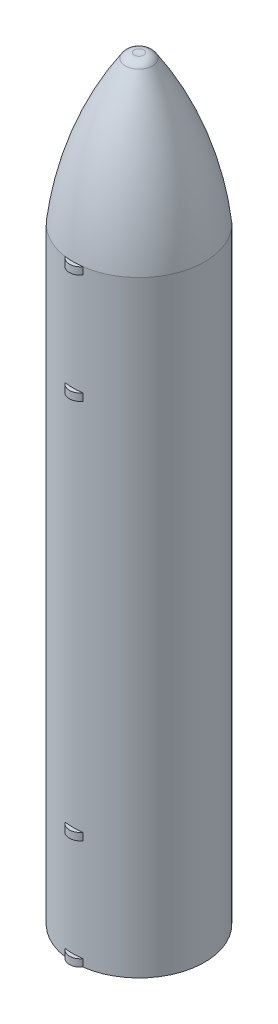
ISO-10303-21;
HEADER;
FILE_DESCRIPTION(('STEP AP214'),'2;1');
FILE_NAME('part.step','',(''),(''),'','','');
FILE_SCHEMA(('AUTOMOTIVE_DESIGN { 1 0 10303 214 1 1 1 1 }'));
ENDSEC;
DATA;
#1=APPLICATION_CONTEXT('core data for automotive mechanical design processes');
#2=APPLICATION_PROTOCOL_DEFINITION('international standard','automotive_design',2000,#1);
#3=PRODUCT_CONTEXT('',#1,'mechanical');
#4=PRODUCT('Part','Part','',(#3));
#5=PRODUCT_RELATED_PRODUCT_CATEGORY('part','',(#4));
#6=PRODUCT_DEFINITION_FORMATION('','',#4);
#7=PRODUCT_DEFINITION_CONTEXT('part definition',#1,'design');
#8=PRODUCT_DEFINITION('design','',#6,#7);
#9=PRODUCT_DEFINITION_SHAPE('','',#8);
#10=(LENGTH_UNIT() NAMED_UNIT(*) SI_UNIT(.MILLI.,.METRE.));
#11=(NAMED_UNIT(*) PLANE_ANGLE_UNIT() SI_UNIT($,.RADIAN.));
#12=(NAMED_UNIT(*) SI_UNIT($,.STERADIAN.) SOLID_ANGLE_UNIT());
#13=UNCERTAINTY_MEASURE_WITH_UNIT(LENGTH_MEASURE(1.E-05),#10,'distance_accuracy_value','');
#14=(GEOMETRIC_REPRESENTATION_CONTEXT(3) GLOBAL_UNCERTAINTY_ASSIGNED_CONTEXT((#13)) GLOBAL_UNIT_ASSIGNED_CONTEXT((#10,
#11,#12)) REPRESENTATION_CONTEXT('',''));
#15=CARTESIAN_POINT('',(0.,0.,0.));
#16=DIRECTION('',(0.,0.,1.));
#17=DIRECTION('',(1.,0.,0.));
#18=AXIS2_PLACEMENT_3D('',#15,#16,#17);
#19=CARTESIAN_POINT('',(0.,41600.,0.));
#20=DIRECTION('',(0.,-1.,0.));
#21=DIRECTION('',(0.,0.,-1.));
#22=AXIS2_PLACEMENT_3D('',#19,#20,#21);
#23=CYLINDRICAL_SURFACE('',#22,4500.);
#24=DIRECTION('',(0.,1.,0.));
#25=VECTOR('',#24,1.);
#26=CARTESIAN_POINT('',(607.254747716938,33600.,4458.83860118027));
#27=LINE('',#26,#25);
#28=CARTESIAN_POINT('',(607.254747716935,33600.,4458.83860118027));
#29=VERTEX_POINT('',#28);
#30=CARTESIAN_POINT('',(607.254747716936,34100.,4458.83860118027));
#31=VERTEX_POINT('',#30);
#32=EDGE_CURVE('E66',#29,#31,#27,.T.);
#33=ORIENTED_EDGE('',*,*,#32,.F.);
#34=CARTESIAN_POINT('',(0.,33600.,0.));
#35=DIRECTION('',(0.,-1.,0.));
#36=DIRECTION('',(0.,0.,-1.));
#37=AXIS2_PLACEMENT_3D('',#34,#35,#36);
#38=CIRCLE('',#37,4500.);
#39=CARTESIAN_POINT('',(-607.254747716937,33600.,4458.83860118027));
#40=VERTEX_POINT('',#39);
#41=EDGE_CURVE('E61',#29,#40,#38,.T.);
#42=ORIENTED_EDGE('',*,*,#41,.T.);
#43=DIRECTION('',(0.,1.,0.));
#44=VECTOR('',#43,1.);
#45=CARTESIAN_POINT('',(-607.254747716937,33600.,4458.83860118027));
#46=LINE('',#45,#44);
#47=CARTESIAN_POINT('',(-607.254747716937,34100.,4458.83860118027));
#48=VERTEX_POINT('',#47);
#49=EDGE_CURVE('E155',#40,#48,#46,.T.);
#50=ORIENTED_EDGE('',*,*,#49,.T.);
#51=CARTESIAN_POINT('',(0.,34100.,0.));
#52=DIRECTION('',(0.,-1.,0.));
#53=DIRECTION('',(0.,0.,-1.));
#54=AXIS2_PLACEMENT_3D('',#51,#52,#53);
#55=CIRCLE('',#54,4500.);
#56=EDGE_CURVE('E159',#31,#48,#55,.T.);
#57=ORIENTED_EDGE('',*,*,#56,.F.);
#58=EDGE_LOOP('',(#33,#42,#50,#57));
#59=FACE_BOUND('',#58,.T.);
#60=CARTESIAN_POINT('',(0.,41100.,0.));
#61=DIRECTION('',(0.,-1.,0.));
#62=DIRECTION('',(0.,0.,-1.));
#63=AXIS2_PLACEMENT_3D('',#60,#61,#62);
#64=CIRCLE('',#63,4500.);
#65=CARTESIAN_POINT('',(607.254747716938,41100.,4458.83860118027));
#66=VERTEX_POINT('',#65);
#67=CARTESIAN_POINT('',(-607.254747716937,41100.,4458.83860118027));
#68=VERTEX_POINT('',#67);
#69=EDGE_CURVE('E206',#66,#68,#64,.T.);
#70=ORIENTED_EDGE('',*,*,#69,.T.);
#71=DIRECTION('',(0.,1.,0.));
#72=VECTOR('',#71,1.);
#73=CARTESIAN_POINT('',(-607.254747716937,41100.,4458.83860118027));
#74=LINE('',#73,#72);
#75=CARTESIAN_POINT('',(-607.254747716937,41600.,4458.83860118027));
#76=VERTEX_POINT('',#75);
#77=EDGE_CURVE('E222',#68,#76,#74,.T.);
#78=ORIENTED_EDGE('',*,*,#77,.T.);
#79=CARTESIAN_POINT('',(0.,41600.,0.));
#80=DIRECTION('',(0.,1.,0.));
#81=DIRECTION('',(0.,0.,1.));
#82=AXIS2_PLACEMENT_3D('',#79,#80,#81);
#83=CIRCLE('',#82,4500.);
#84=CARTESIAN_POINT('',(-607.254747716937,41600.,-4458.83860118027));
#85=VERTEX_POINT('',#84);
#86=EDGE_CURVE('E54',#85,#76,#83,.T.);
#87=ORIENTED_EDGE('',*,*,#86,.F.);
#88=DIRECTION('',(0.,1.,0.));
#89=VECTOR('',#88,1.);
#90=CARTESIAN_POINT('',(-607.254747716938,41100.,-4458.83860118027));
#91=LINE('',#90,#89);
#92=CARTESIAN_POINT('',(-607.254747716938,41100.,-4458.83860118027));
#93=VERTEX_POINT('',#92);
#94=EDGE_CURVE('E235',#93,#85,#91,.T.);
#95=ORIENTED_EDGE('',*,*,#94,.F.);
#96=CARTESIAN_POINT('',(0.,41100.,0.));
#97=DIRECTION('',(0.,-1.,0.));
#98=DIRECTION('',(0.,0.,-1.));
#99=AXIS2_PLACEMENT_3D('',#96,#97,#98);
#100=CIRCLE('',#99,4500.);
#101=CARTESIAN_POINT('',(607.254747716937,41100.,-4458.83860118027));
#102=VERTEX_POINT('',#101);
#103=EDGE_CURVE('E230',#93,#102,#100,.T.);
#104=ORIENTED_EDGE('',*,*,#103,.T.);
#105=DIRECTION('',(0.,1.,0.));
#106=VECTOR('',#105,1.);
#107=CARTESIAN_POINT('',(607.254747716937,41100.,-4458.83860118027));
#108=LINE('',#107,#106);
#109=CARTESIAN_POINT('',(607.254747716937,41600.,-4458.83860118027));
#110=VERTEX_POINT('',#109);
#111=EDGE_CURVE('E215',#102,#110,#108,.T.);
#112=ORIENTED_EDGE('',*,*,#111,.T.);
#113=CARTESIAN_POINT('',(607.254747716936,41600.,4458.83860118027));
#114=VERTEX_POINT('',#113);
#115=EDGE_CURVE('E11',#114,#110,#83,.T.);
#116=ORIENTED_EDGE('',*,*,#115,.F.);
#117=DIRECTION('',(0.,1.,0.));
#118=VECTOR('',#117,1.);
#119=CARTESIAN_POINT('',(607.254747716938,41100.,4458.83860118027));
#120=LINE('',#119,#118);
#121=EDGE_CURVE('E211',#66,#114,#120,.T.);
#122=ORIENTED_EDGE('',*,*,#121,.F.);
#123=EDGE_LOOP('',(#70,#78,#87,#95,#104,#112,#116,#122));
#124=FACE_BOUND('',#123,.T.);
#125=DIRECTION('',(0.,-1.,0.));
#126=VECTOR('',#125,1.);
#127=CARTESIAN_POINT('',(-607.254747716937,8000.,4458.83860118027));
#128=LINE('',#127,#126);
#129=CARTESIAN_POINT('',(-607.254747716937,8000.,4458.83860118027));
#130=VERTEX_POINT('',#129);
#131=CARTESIAN_POINT('',(-607.254747716938,7500.,4458.83860118027));
#132=VERTEX_POINT('',#131);
#133=EDGE_CURVE('E256',#130,#132,#128,.T.);
#134=ORIENTED_EDGE('',*,*,#133,.F.);
#135=CARTESIAN_POINT('',(0.,8000.,0.));
#136=DIRECTION('',(0.,-1.,0.));
#137=DIRECTION('',(0.,0.,-1.));
#138=AXIS2_PLACEMENT_3D('',#135,#136,#137);
#139=CIRCLE('',#138,4500.);
#140=CARTESIAN_POINT('',(607.254747716935,8000.,4458.83860118027));
#141=VERTEX_POINT('',#140);
#142=EDGE_CURVE('E251',#141,#130,#139,.T.);
#143=ORIENTED_EDGE('',*,*,#142,.F.);
#144=DIRECTION('',(0.,-1.,0.));
#145=VECTOR('',#144,1.);
#146=CARTESIAN_POINT('',(607.254747716938,8000.,4458.83860118027));
#147=LINE('',#146,#145);
#148=CARTESIAN_POINT('',(607.254747716938,7500.,4458.83860118027));
#149=VERTEX_POINT('',#148);
#150=EDGE_CURVE('E267',#141,#149,#147,.T.);
#151=ORIENTED_EDGE('',*,*,#150,.T.);
#152=CARTESIAN_POINT('',(0.,7500.,0.));
#153=DIRECTION('',(0.,-1.,0.));
#154=DIRECTION('',(0.,0.,-1.));
#155=AXIS2_PLACEMENT_3D('',#152,#153,#154);
#156=CIRCLE('',#155,4500.);
#157=EDGE_CURVE('E252',#149,#132,#156,.T.);
#158=ORIENTED_EDGE('',*,*,#157,.T.);
#159=EDGE_LOOP('',(#134,#143,#151,#158));
#160=FACE_BOUND('',#159,.T.);
#161=DIRECTION('',(0.,-1.,0.));
#162=VECTOR('',#161,1.);
#163=CARTESIAN_POINT('',(-607.254747716937,500.,4458.83860118027));
#164=LINE('',#163,#162);
#165=CARTESIAN_POINT('',(-607.254747716938,500.,4458.83860118027));
#166=VERTEX_POINT('',#165);
#167=CARTESIAN_POINT('',(-607.254747716937,0.,4458.83860118027));
#168=VERTEX_POINT('',#167);
#169=EDGE_CURVE('E300',#166,#168,#164,.T.);
#170=ORIENTED_EDGE('',*,*,#169,.F.);
#171=CARTESIAN_POINT('',(0.,500.,0.));
#172=DIRECTION('',(0.,-1.,0.));
#173=DIRECTION('',(0.,0.,-1.));
#174=AXIS2_PLACEMENT_3D('',#171,#172,#173);
#175=CIRCLE('',#174,4500.);
#176=CARTESIAN_POINT('',(607.254747716936,500.,4458.83860118027));
#177=VERTEX_POINT('',#176);
#178=EDGE_CURVE('E295',#177,#166,#175,.T.);
#179=ORIENTED_EDGE('',*,*,#178,.F.);
#180=DIRECTION('',(0.,-1.,0.));
#181=VECTOR('',#180,1.);
#182=CARTESIAN_POINT('',(607.254747716938,500.,4458.83860118027));
#183=LINE('',#182,#181);
#184=CARTESIAN_POINT('',(607.254747716938,0.,4458.83860118027));
#185=VERTEX_POINT('',#184);
#186=EDGE_CURVE('E308',#177,#185,#183,.T.);
#187=ORIENTED_EDGE('',*,*,#186,.T.);
#188=CARTESIAN_POINT('',(0.,0.,0.));
#189=DIRECTION('',(0.,1.,0.));
#190=DIRECTION('',(0.,0.,1.));
#191=AXIS2_PLACEMENT_3D('',#188,#189,#190);
#192=CIRCLE('',#191,4500.);
#193=CARTESIAN_POINT('',(607.254747716937,0.,-4458.83860118027));
#194=VERTEX_POINT('',#193);
#195=EDGE_CURVE('E48',#185,#194,#192,.T.);
#196=ORIENTED_EDGE('',*,*,#195,.T.);
#197=DIRECTION('',(0.,-1.,0.));
#198=VECTOR('',#197,1.);
#199=CARTESIAN_POINT('',(607.254747716937,500.,-4458.83860118027));
#200=LINE('',#199,#198);
#201=CARTESIAN_POINT('',(607.254747716937,500.,-4458.83860118027));
#202=VERTEX_POINT('',#201);
#203=EDGE_CURVE('E313',#202,#194,#200,.T.);
#204=ORIENTED_EDGE('',*,*,#203,.F.);
#205=CARTESIAN_POINT('',(0.,500.,0.));
#206=DIRECTION('',(0.,-1.,0.));
#207=DIRECTION('',(0.,0.,-1.));
#208=AXIS2_PLACEMENT_3D('',#205,#206,#207);
#209=CIRCLE('',#208,4500.);
#210=CARTESIAN_POINT('',(-607.254747716937,500.,-4458.83860118027));
#211=VERTEX_POINT('',#210);
#212=EDGE_CURVE('E317',#211,#202,#209,.T.);
#213=ORIENTED_EDGE('',*,*,#212,.F.);
#214=DIRECTION('',(0.,-1.,0.));
#215=VECTOR('',#214,1.);
#216=CARTESIAN_POINT('',(-607.254747716938,500.,-4458.83860118027));
#217=LINE('',#216,#215);
#218=CARTESIAN_POINT('',(-607.254747716938,0.,-4458.83860118027));
#219=VERTEX_POINT('',#218);
#220=EDGE_CURVE('E270',#211,#219,#217,.T.);
#221=ORIENTED_EDGE('',*,*,#220,.T.);
#222=EDGE_CURVE('E337',#219,#168,#192,.T.);
#223=ORIENTED_EDGE('',*,*,#222,.T.);
#224=EDGE_LOOP('',(#170,#179,#187,#196,#204,#213,#221,#223));
#225=FACE_BOUND('',#224,.T.);
#226=CARTESIAN_POINT('',(0.,8000.,0.));
#227=DIRECTION('',(0.,-1.,0.));
#228=DIRECTION('',(0.,0.,-1.));
#229=AXIS2_PLACEMENT_3D('',#226,#227,#228);
#230=CIRCLE('',#229,4500.);
#231=CARTESIAN_POINT('',(-607.254747716938,8000.,-4458.83860118027));
#232=VERTEX_POINT('',#231);
#233=CARTESIAN_POINT('',(607.254747716937,8000.,-4458.83860118027));
#234=VERTEX_POINT('',#233);
#235=EDGE_CURVE('E275',#232,#234,#230,.T.);
#236=ORIENTED_EDGE('',*,*,#235,.F.);
#237=DIRECTION('',(0.,-1.,0.));
#238=VECTOR('',#237,1.);
#239=CARTESIAN_POINT('',(-607.254747716938,8000.,-4458.83860118027));
#240=LINE('',#239,#238);
#241=CARTESIAN_POINT('',(-607.254747716938,7500.,-4458.83860118027));
#242=VERTEX_POINT('',#241);
#243=EDGE_CURVE('E261',#232,#242,#240,.T.);
#244=ORIENTED_EDGE('',*,*,#243,.T.);
#245=CARTESIAN_POINT('',(0.,7500.,0.));
#246=DIRECTION('',(0.,-1.,0.));
#247=DIRECTION('',(0.,0.,-1.));
#248=AXIS2_PLACEMENT_3D('',#245,#246,#247);
#249=CIRCLE('',#248,4500.);
#250=CARTESIAN_POINT('',(607.254747716937,7500.,-4458.83860118027));
#251=VERTEX_POINT('',#250);
#252=EDGE_CURVE('E276',#242,#251,#249,.T.);
#253=ORIENTED_EDGE('',*,*,#252,.T.);
#254=DIRECTION('',(0.,-1.,0.));
#255=VECTOR('',#254,1.);
#256=CARTESIAN_POINT('',(607.254747716937,8000.,-4458.83860118027));
#257=LINE('',#256,#255);
#258=EDGE_CURVE('E279',#234,#251,#257,.T.);
#259=ORIENTED_EDGE('',*,*,#258,.F.);
#260=EDGE_LOOP('',(#236,#244,#253,#259));
#261=FACE_BOUND('',#260,.T.);
#262=CARTESIAN_POINT('',(0.,33600.,0.));
#263=DIRECTION('',(0.,-1.,0.));
#264=DIRECTION('',(0.,0.,-1.));
#265=AXIS2_PLACEMENT_3D('',#262,#263,#264);
#266=CIRCLE('',#265,4500.);
#267=CARTESIAN_POINT('',(-607.254747716938,33600.,-4458.83860118027));
#268=VERTEX_POINT('',#267);
#269=CARTESIAN_POINT('',(607.254747716937,33600.,-4458.83860118027));
#270=VERTEX_POINT('',#269);
#271=EDGE_CURVE('E185',#268,#270,#266,.T.);
#272=ORIENTED_EDGE('',*,*,#271,.T.);
#273=DIRECTION('',(0.,1.,0.));
#274=VECTOR('',#273,1.);
#275=CARTESIAN_POINT('',(607.254747716937,33600.,-4458.83860118027));
#276=LINE('',#275,#274);
#277=CARTESIAN_POINT('',(607.254747716937,34100.,-4458.83860118027));
#278=VERTEX_POINT('',#277);
#279=EDGE_CURVE('E170',#270,#278,#276,.T.);
#280=ORIENTED_EDGE('',*,*,#279,.T.);
#281=CARTESIAN_POINT('',(0.,34100.,0.));
#282=DIRECTION('',(0.,-1.,0.));
#283=DIRECTION('',(0.,0.,-1.));
#284=AXIS2_PLACEMENT_3D('',#281,#282,#283);
#285=CIRCLE('',#284,4500.);
#286=CARTESIAN_POINT('',(-607.254747716937,34100.,-4458.83860118027));
#287=VERTEX_POINT('',#286);
#288=EDGE_CURVE('E186',#287,#278,#285,.T.);
#289=ORIENTED_EDGE('',*,*,#288,.F.);
#290=DIRECTION('',(0.,1.,0.));
#291=VECTOR('',#290,1.);
#292=CARTESIAN_POINT('',(-607.254747716938,33600.,-4458.83860118027));
#293=LINE('',#292,#291);
#294=EDGE_CURVE('E190',#268,#287,#293,.T.);
#295=ORIENTED_EDGE('',*,*,#294,.F.);
#296=EDGE_LOOP('',(#272,#280,#289,#295));
#297=FACE_BOUND('',#296,.T.);
#298=ADVANCED_FACE('F45',(#59,#124,#160,#225,#261,#297),#23,.T.);
#299=CARTESIAN_POINT('',(0.,0.,0.));
#300=DIRECTION('',(0.,1.,0.));
#301=DIRECTION('',(0.,0.,1.));
#302=AXIS2_PLACEMENT_3D('',#299,#300,#301);
#303=PLANE('',#302);
#304=ORIENTED_EDGE('',*,*,#195,.F.);
#305=CARTESIAN_POINT('',(-9.84292141829682E-13,0.,4018.67764042246));
#306=DIRECTION('',(0.,1.,0.));
#307=DIRECTION('',(0.,0.,1.));
#308=AXIS2_PLACEMENT_3D('',#305,#306,#307);
#309=CIRCLE('',#308,749.999999999998);
#310=EDGE_CURVE('E296',#168,#185,#309,.T.);
#311=ORIENTED_EDGE('',*,*,#310,.F.);
#312=ORIENTED_EDGE('',*,*,#222,.F.);
#313=CARTESIAN_POINT('',(0.,0.,-4018.67764042246));
#314=DIRECTION('',(0.,-1.,0.));
#315=DIRECTION('',(0.,0.,-1.));
#316=AXIS2_PLACEMENT_3D('',#313,#314,#315);
#317=CIRCLE('',#316,749.999999999998);
#318=EDGE_CURVE('E304',#219,#194,#317,.T.);
#319=ORIENTED_EDGE('',*,*,#318,.T.);
#320=EDGE_LOOP('',(#304,#311,#312,#319));
#321=FACE_BOUND('',#320,.T.);
#322=ADVANCED_FACE('F378',(#321),#303,.F.);
#323=CARTESIAN_POINT('',(0.,39138.2485032371,0.));
#324=DIRECTION('',(0.,1.,0.));
#325=DIRECTION('',(-1.,0.,0.));
#326=AXIS2_PLACEMENT_3D('',#323,#324,#325);
#327=DEGENERATE_TOROIDAL_SURFACE('',#326,17690.3080725105,22326.441561179,.F.);
#328=CARTESIAN_POINT('',(0.,51456.5596988805,0.));
#329=DIRECTION('',(0.,1.,0.));
#330=DIRECTION('',(-1.,0.,0.));
#331=AXIS2_PLACEMENT_3D('',#328,#329,#330);
#332=CIRCLE('',#331,930.357921809479);
#333=CARTESIAN_POINT('',(-930.357921809479,51456.5596988805,0.));
#334=VERTEX_POINT('',#333);
#335=EDGE_CURVE('E312',#334,#334,#332,.T.);
#336=ORIENTED_EDGE('',*,*,#335,.F.);
#337=EDGE_LOOP('',(#336));
#338=FACE_BOUND('',#337,.T.);
#339=ORIENTED_EDGE('',*,*,#115,.T.);
#340=CARTESIAN_POINT('',(0.,41600.,0.));
#341=DIRECTION('',(0.,-1.,0.));
#342=DIRECTION('',(0.,0.,-1.));
#343=AXIS2_PLACEMENT_3D('',#340,#341,#342);
#344=CIRCLE('',#343,4500.);
#345=EDGE_CURVE('E231',#85,#110,#344,.T.);
#346=ORIENTED_EDGE('',*,*,#345,.F.);
#347=ORIENTED_EDGE('',*,*,#86,.T.);
#348=CARTESIAN_POINT('',(0.,41600.,0.));
#349=DIRECTION('',(0.,-1.,0.));
#350=DIRECTION('',(0.,0.,-1.));
#351=AXIS2_PLACEMENT_3D('',#348,#349,#350);
#352=CIRCLE('',#351,4500.);
#353=EDGE_CURVE('E207',#114,#76,#352,.T.);
#354=ORIENTED_EDGE('',*,*,#353,.F.);
#355=EDGE_LOOP('',(#339,#346,#347,#354));
#356=FACE_BOUND('',#355,.T.);
#357=ADVANCED_FACE('F349',(#338,#356),#327,.F.);
#358=CARTESIAN_POINT('',(0.,51786.1860617529,0.));
#359=DIRECTION('',(0.,-1.,0.));
#360=DIRECTION('',(1.,0.,0.));
#361=AXIS2_PLACEMENT_3D('',#358,#359,#360);
#362=PLANE('',#361);
#363=CARTESIAN_POINT('',(0.,51786.1860617529,0.));
#364=DIRECTION('',(0.,1.,0.));
#365=DIRECTION('',(-1.,0.,0.));
#366=AXIS2_PLACEMENT_3D('',#363,#364,#365);
#367=CIRCLE('',#366,317.070306461789);
#368=CARTESIAN_POINT('',(-317.070306461789,51786.1860617529,0.));
#369=VERTEX_POINT('',#368);
#370=EDGE_CURVE('E334',#369,#369,#367,.T.);
#371=ORIENTED_EDGE('',*,*,#370,.T.);
#372=EDGE_LOOP('',(#371));
#373=FACE_BOUND('',#372,.T.);
#374=ADVANCED_FACE('F389',(#373),#362,.F.);
#375=CARTESIAN_POINT('',(0.,51050.8455477008,0.));
#376=DIRECTION('',(0.,1.,0.));
#377=DIRECTION('',(-1.,0.,0.));
#378=AXIS2_PLACEMENT_3D('',#375,#376,#377);
#379=DEGENERATE_TOROIDAL_SURFACE('',#378,317.070306461789,735.340514052042,.T.);
#380=ORIENTED_EDGE('',*,*,#370,.F.);
#381=EDGE_LOOP('',(#380));
#382=FACE_BOUND('',#381,.T.);
#383=ORIENTED_EDGE('',*,*,#335,.T.);
#384=EDGE_LOOP('',(#383));
#385=FACE_BOUND('',#384,.T.);
#386=ADVANCED_FACE('F395',(#382,#385),#379,.T.);
#387=CARTESIAN_POINT('',(0.,500.,-4018.67764042246));
#388=DIRECTION('',(0.,-1.,0.));
#389=DIRECTION('',(0.,0.,-1.));
#390=AXIS2_PLACEMENT_3D('',#387,#388,#389);
#391=CYLINDRICAL_SURFACE('',#390,749.999999999998);
#392=ORIENTED_EDGE('',*,*,#318,.F.);
#393=ORIENTED_EDGE('',*,*,#220,.F.);
#394=CARTESIAN_POINT('',(0.,500.,-4018.67764042246));
#395=DIRECTION('',(0.,-1.,0.));
#396=DIRECTION('',(0.,0.,-1.));
#397=AXIS2_PLACEMENT_3D('',#394,#395,#396);
#398=CIRCLE('',#397,749.999999999998);
#399=EDGE_CURVE('E324',#211,#202,#398,.T.);
#400=ORIENTED_EDGE('',*,*,#399,.T.);
#401=ORIENTED_EDGE('',*,*,#203,.T.);
#402=EDGE_LOOP('',(#392,#393,#400,#401));
#403=FACE_BOUND('',#402,.T.);
#404=ADVANCED_FACE('F397',(#403),#391,.T.);
#405=CARTESIAN_POINT('',(0.,500.,-2009.33882021123));
#406=DIRECTION('',(0.,-1.,0.));
#407=DIRECTION('',(0.,0.,-1.));
#408=AXIS2_PLACEMENT_3D('',#405,#406,#407);
#409=PLANE('',#408);
#410=ORIENTED_EDGE('',*,*,#399,.F.);
#411=ORIENTED_EDGE('',*,*,#212,.T.);
#412=EDGE_LOOP('',(#410,#411));
#413=FACE_BOUND('',#412,.T.);
#414=ADVANCED_FACE('F399',(#413),#409,.F.);
#415=CARTESIAN_POINT('',(-9.84292141829682E-13,500.,4018.67764042246));
#416=DIRECTION('',(0.,-1.,0.));
#417=DIRECTION('',(0.,0.,-1.));
#418=AXIS2_PLACEMENT_3D('',#415,#416,#417);
#419=CYLINDRICAL_SURFACE('',#418,749.999999999998);
#420=ORIENTED_EDGE('',*,*,#310,.T.);
#421=ORIENTED_EDGE('',*,*,#186,.F.);
#422=CARTESIAN_POINT('',(-9.84292141829682E-13,500.,4018.67764042246));
#423=DIRECTION('',(0.,1.,0.));
#424=DIRECTION('',(0.,0.,1.));
#425=AXIS2_PLACEMENT_3D('',#422,#423,#424);
#426=CIRCLE('',#425,749.999999999998);
#427=EDGE_CURVE('E291',#166,#177,#426,.T.);
#428=ORIENTED_EDGE('',*,*,#427,.F.);
#429=ORIENTED_EDGE('',*,*,#169,.T.);
#430=EDGE_LOOP('',(#420,#421,#428,#429));
#431=FACE_BOUND('',#430,.T.);
#432=ADVANCED_FACE('F402',(#431),#419,.T.);
#433=CARTESIAN_POINT('',(-4.92146070914841E-13,500.,2009.33882021123));
#434=DIRECTION('',(0.,1.,0.));
#435=DIRECTION('',(0.,0.,1.));
#436=AXIS2_PLACEMENT_3D('',#433,#434,#435);
#437=PLANE('',#436);
#438=ORIENTED_EDGE('',*,*,#427,.T.);
#439=ORIENTED_EDGE('',*,*,#178,.T.);
#440=EDGE_LOOP('',(#438,#439));
#441=FACE_BOUND('',#440,.T.);
#442=ADVANCED_FACE('F408',(#441),#437,.T.);
#443=CARTESIAN_POINT('',(0.,8000.,-4018.67764042246));
#444=DIRECTION('',(0.,-1.,0.));
#445=DIRECTION('',(0.,0.,-1.));
#446=AXIS2_PLACEMENT_3D('',#443,#444,#445);
#447=CYLINDRICAL_SURFACE('',#446,749.999999999998);
#448=CARTESIAN_POINT('',(0.,7500.,-4018.67764042246));
#449=DIRECTION('',(0.,-1.,0.));
#450=DIRECTION('',(0.,0.,-1.));
#451=AXIS2_PLACEMENT_3D('',#448,#449,#450);
#452=CIRCLE('',#451,749.999999999998);
#453=EDGE_CURVE('E226',#242,#251,#452,.T.);
#454=ORIENTED_EDGE('',*,*,#453,.F.);
#455=ORIENTED_EDGE('',*,*,#243,.F.);
#456=CARTESIAN_POINT('',(0.,8000.,-4018.67764042246));
#457=DIRECTION('',(0.,-1.,0.));
#458=DIRECTION('',(0.,0.,-1.));
#459=AXIS2_PLACEMENT_3D('',#456,#457,#458);
#460=CIRCLE('',#459,749.999999999998);
#461=EDGE_CURVE('E271',#232,#234,#460,.T.);
#462=ORIENTED_EDGE('',*,*,#461,.T.);
#463=ORIENTED_EDGE('',*,*,#258,.T.);
#464=EDGE_LOOP('',(#454,#455,#462,#463));
#465=FACE_BOUND('',#464,.T.);
#466=ADVANCED_FACE('F412',(#465),#447,.T.);
#467=CARTESIAN_POINT('',(0.,8000.,-2009.33882021123));
#468=DIRECTION('',(0.,-1.,0.));
#469=DIRECTION('',(0.,0.,-1.));
#470=AXIS2_PLACEMENT_3D('',#467,#468,#469);
#471=PLANE('',#470);
#472=ORIENTED_EDGE('',*,*,#461,.F.);
#473=ORIENTED_EDGE('',*,*,#235,.T.);
#474=EDGE_LOOP('',(#472,#473));
#475=FACE_BOUND('',#474,.T.);
#476=ADVANCED_FACE('F416',(#475),#471,.F.);
#477=CARTESIAN_POINT('',(0.,7500.,-2009.33882021123));
#478=DIRECTION('',(0.,-1.,0.));
#479=DIRECTION('',(0.,0.,-1.));
#480=AXIS2_PLACEMENT_3D('',#477,#478,#479);
#481=PLANE('',#480);
#482=ORIENTED_EDGE('',*,*,#453,.T.);
#483=ORIENTED_EDGE('',*,*,#252,.F.);
#484=EDGE_LOOP('',(#482,#483));
#485=FACE_BOUND('',#484,.T.);
#486=ADVANCED_FACE('F418',(#485),#481,.T.);
#487=CARTESIAN_POINT('',(-9.84292141829682E-13,8000.,4018.67764042246));
#488=DIRECTION('',(0.,-1.,0.));
#489=DIRECTION('',(0.,0.,-1.));
#490=AXIS2_PLACEMENT_3D('',#487,#488,#489);
#491=CYLINDRICAL_SURFACE('',#490,749.999999999998);
#492=CARTESIAN_POINT('',(-9.84292141829682E-13,7500.,4018.67764042246));
#493=DIRECTION('',(0.,1.,0.));
#494=DIRECTION('',(0.,0.,1.));
#495=AXIS2_PLACEMENT_3D('',#492,#493,#494);
#496=CIRCLE('',#495,749.999999999998);
#497=EDGE_CURVE('E257',#132,#149,#496,.T.);
#498=ORIENTED_EDGE('',*,*,#497,.T.);
#499=ORIENTED_EDGE('',*,*,#150,.F.);
#500=CARTESIAN_POINT('',(-9.84292141829682E-13,8000.,4018.67764042246));
#501=DIRECTION('',(0.,1.,0.));
#502=DIRECTION('',(0.,0.,1.));
#503=AXIS2_PLACEMENT_3D('',#500,#501,#502);
#504=CIRCLE('',#503,749.999999999998);
#505=EDGE_CURVE('E247',#130,#141,#504,.T.);
#506=ORIENTED_EDGE('',*,*,#505,.F.);
#507=ORIENTED_EDGE('',*,*,#133,.T.);
#508=EDGE_LOOP('',(#498,#499,#506,#507));
#509=FACE_BOUND('',#508,.T.);
#510=ADVANCED_FACE('F421',(#509),#491,.T.);
#511=CARTESIAN_POINT('',(-4.92146070914841E-13,8000.,2009.33882021123));
#512=DIRECTION('',(0.,1.,0.));
#513=DIRECTION('',(0.,0.,1.));
#514=AXIS2_PLACEMENT_3D('',#511,#512,#513);
#515=PLANE('',#514);
#516=ORIENTED_EDGE('',*,*,#505,.T.);
#517=ORIENTED_EDGE('',*,*,#142,.T.);
#518=EDGE_LOOP('',(#516,#517));
#519=FACE_BOUND('',#518,.T.);
#520=ADVANCED_FACE('F428',(#519),#515,.T.);
#521=CARTESIAN_POINT('',(-4.92146070914841E-13,7500.,2009.33882021123));
#522=DIRECTION('',(0.,1.,0.));
#523=DIRECTION('',(0.,0.,1.));
#524=AXIS2_PLACEMENT_3D('',#521,#522,#523);
#525=PLANE('',#524);
#526=ORIENTED_EDGE('',*,*,#497,.F.);
#527=ORIENTED_EDGE('',*,*,#157,.F.);
#528=EDGE_LOOP('',(#526,#527));
#529=FACE_BOUND('',#528,.T.);
#530=ADVANCED_FACE('F430',(#529),#525,.F.);
#531=CARTESIAN_POINT('',(0.,41100.,-4018.67764042246));
#532=DIRECTION('',(0.,1.,0.));
#533=DIRECTION('',(0.,0.,1.));
#534=AXIS2_PLACEMENT_3D('',#531,#532,#533);
#535=CYLINDRICAL_SURFACE('',#534,749.999999999998);
#536=CARTESIAN_POINT('',(0.,41600.,-4018.67764042246));
#537=DIRECTION('',(0.,-1.,0.));
#538=DIRECTION('',(0.,0.,-1.));
#539=AXIS2_PLACEMENT_3D('',#536,#537,#538);
#540=CIRCLE('',#539,749.999999999998);
#541=EDGE_CURVE('E163',#85,#110,#540,.T.);
#542=ORIENTED_EDGE('',*,*,#541,.T.);
#543=ORIENTED_EDGE('',*,*,#111,.F.);
#544=CARTESIAN_POINT('',(0.,41100.,-4018.67764042246));
#545=DIRECTION('',(0.,-1.,0.));
#546=DIRECTION('',(0.,0.,-1.));
#547=AXIS2_PLACEMENT_3D('',#544,#545,#546);
#548=CIRCLE('',#547,749.999999999998);
#549=EDGE_CURVE('E227',#93,#102,#548,.T.);
#550=ORIENTED_EDGE('',*,*,#549,.F.);
#551=ORIENTED_EDGE('',*,*,#94,.T.);
#552=EDGE_LOOP('',(#542,#543,#550,#551));
#553=FACE_BOUND('',#552,.T.);
#554=ADVANCED_FACE('F363',(#553),#535,.T.);
#555=CARTESIAN_POINT('',(0.,41100.,-2009.33882021123));
#556=DIRECTION('',(0.,1.,0.));
#557=DIRECTION('',(0.,0.,-1.));
#558=AXIS2_PLACEMENT_3D('',#555,#556,#557);
#559=PLANE('',#558);
#560=ORIENTED_EDGE('',*,*,#549,.T.);
#561=ORIENTED_EDGE('',*,*,#103,.F.);
#562=EDGE_LOOP('',(#560,#561));
#563=FACE_BOUND('',#562,.T.);
#564=ADVANCED_FACE('F367',(#563),#559,.F.);
#565=CARTESIAN_POINT('',(0.,41600.,-2009.33882021123));
#566=DIRECTION('',(0.,1.,0.));
#567=DIRECTION('',(0.,0.,-1.));
#568=AXIS2_PLACEMENT_3D('',#565,#566,#567);
#569=PLANE('',#568);
#570=ORIENTED_EDGE('',*,*,#541,.F.);
#571=ORIENTED_EDGE('',*,*,#345,.T.);
#572=EDGE_LOOP('',(#570,#571));
#573=FACE_BOUND('',#572,.T.);
#574=ADVANCED_FACE('F365',(#573),#569,.T.);
#575=CARTESIAN_POINT('',(-9.84292141829682E-13,41100.,4018.67764042246));
#576=DIRECTION('',(0.,1.,0.));
#577=DIRECTION('',(0.,0.,1.));
#578=AXIS2_PLACEMENT_3D('',#575,#576,#577);
#579=CYLINDRICAL_SURFACE('',#578,749.999999999998);
#580=CARTESIAN_POINT('',(-9.84292141829682E-13,41600.,4018.67764042246));
#581=DIRECTION('',(0.,1.,0.));
#582=DIRECTION('',(0.,0.,1.));
#583=AXIS2_PLACEMENT_3D('',#580,#581,#582);
#584=CIRCLE('',#583,749.999999999998);
#585=EDGE_CURVE('E212',#76,#114,#584,.T.);
#586=ORIENTED_EDGE('',*,*,#585,.F.);
#587=ORIENTED_EDGE('',*,*,#77,.F.);
#588=CARTESIAN_POINT('',(-9.84292141829682E-13,41100.,4018.67764042246));
#589=DIRECTION('',(0.,1.,0.));
#590=DIRECTION('',(0.,0.,1.));
#591=AXIS2_PLACEMENT_3D('',#588,#589,#590);
#592=CIRCLE('',#591,749.999999999998);
#593=EDGE_CURVE('E203',#68,#66,#592,.T.);
#594=ORIENTED_EDGE('',*,*,#593,.T.);
#595=ORIENTED_EDGE('',*,*,#121,.T.);
#596=EDGE_LOOP('',(#586,#587,#594,#595));
#597=FACE_BOUND('',#596,.T.);
#598=ADVANCED_FACE('F357',(#597),#579,.T.);
#599=CARTESIAN_POINT('',(-4.92146070914841E-13,41100.,2009.33882021123));
#600=DIRECTION('',(0.,-1.,0.));
#601=DIRECTION('',(0.,0.,1.));
#602=AXIS2_PLACEMENT_3D('',#599,#600,#601);
#603=PLANE('',#602);
#604=ORIENTED_EDGE('',*,*,#593,.F.);
#605=ORIENTED_EDGE('',*,*,#69,.F.);
#606=EDGE_LOOP('',(#604,#605));
#607=FACE_BOUND('',#606,.T.);
#608=ADVANCED_FACE('F359',(#607),#603,.T.);
#609=CARTESIAN_POINT('',(-4.92146070914841E-13,41600.,2009.33882021123));
#610=DIRECTION('',(0.,-1.,0.));
#611=DIRECTION('',(0.,0.,1.));
#612=AXIS2_PLACEMENT_3D('',#609,#610,#611);
#613=PLANE('',#612);
#614=ORIENTED_EDGE('',*,*,#585,.T.);
#615=ORIENTED_EDGE('',*,*,#353,.T.);
#616=EDGE_LOOP('',(#614,#615));
#617=FACE_BOUND('',#616,.T.);
#618=ADVANCED_FACE('F466',(#617),#613,.F.);
#619=CARTESIAN_POINT('',(0.,33600.,-4018.67764042246));
#620=DIRECTION('',(0.,1.,0.));
#621=DIRECTION('',(0.,0.,1.));
#622=AXIS2_PLACEMENT_3D('',#619,#620,#621);
#623=CYLINDRICAL_SURFACE('',#622,749.999999999998);
#624=CARTESIAN_POINT('',(0.,34100.,-4018.67764042246));
#625=DIRECTION('',(0.,-1.,0.));
#626=DIRECTION('',(0.,0.,-1.));
#627=AXIS2_PLACEMENT_3D('',#624,#625,#626);
#628=CIRCLE('',#627,749.999999999998);
#629=EDGE_CURVE('E191',#287,#278,#628,.T.);
#630=ORIENTED_EDGE('',*,*,#629,.T.);
#631=ORIENTED_EDGE('',*,*,#279,.F.);
#632=CARTESIAN_POINT('',(0.,33600.,-4018.67764042246));
#633=DIRECTION('',(0.,-1.,0.));
#634=DIRECTION('',(0.,0.,-1.));
#635=AXIS2_PLACEMENT_3D('',#632,#633,#634);
#636=CIRCLE('',#635,749.999999999998);
#637=EDGE_CURVE('E182',#268,#270,#636,.T.);
#638=ORIENTED_EDGE('',*,*,#637,.F.);
#639=ORIENTED_EDGE('',*,*,#294,.T.);
#640=EDGE_LOOP('',(#630,#631,#638,#639));
#641=FACE_BOUND('',#640,.T.);
#642=ADVANCED_FACE('F474',(#641),#623,.T.);
#643=CARTESIAN_POINT('',(0.,33600.,-2009.33882021123));
#644=DIRECTION('',(0.,1.,0.));
#645=DIRECTION('',(0.,0.,-1.));
#646=AXIS2_PLACEMENT_3D('',#643,#644,#645);
#647=PLANE('',#646);
#648=ORIENTED_EDGE('',*,*,#637,.T.);
#649=ORIENTED_EDGE('',*,*,#271,.F.);
#650=EDGE_LOOP('',(#648,#649));
#651=FACE_BOUND('',#650,.T.);
#652=ADVANCED_FACE('F489',(#651),#647,.F.);
#653=CARTESIAN_POINT('',(0.,34100.,-2009.33882021123));
#654=DIRECTION('',(0.,1.,0.));
#655=DIRECTION('',(0.,0.,-1.));
#656=AXIS2_PLACEMENT_3D('',#653,#654,#655);
#657=PLANE('',#656);
#658=ORIENTED_EDGE('',*,*,#629,.F.);
#659=ORIENTED_EDGE('',*,*,#288,.T.);
#660=EDGE_LOOP('',(#658,#659));
#661=FACE_BOUND('',#660,.T.);
#662=ADVANCED_FACE('F499',(#661),#657,.T.);
#663=CARTESIAN_POINT('',(-9.84292141829682E-13,33600.,4018.67764042246));
#664=DIRECTION('',(0.,1.,0.));
#665=DIRECTION('',(0.,0.,1.));
#666=AXIS2_PLACEMENT_3D('',#663,#664,#665);
#667=CYLINDRICAL_SURFACE('',#666,749.999999999998);
#668=CARTESIAN_POINT('',(-9.84292141829682E-13,34100.,4018.67764042246));
#669=DIRECTION('',(0.,1.,0.));
#670=DIRECTION('',(0.,0.,1.));
#671=AXIS2_PLACEMENT_3D('',#668,#669,#670);
#672=CIRCLE('',#671,749.999999999998);
#673=EDGE_CURVE('E166',#48,#31,#672,.T.);
#674=ORIENTED_EDGE('',*,*,#673,.F.);
#675=ORIENTED_EDGE('',*,*,#49,.F.);
#676=CARTESIAN_POINT('',(-9.84292141829682E-13,33600.,4018.67764042246));
#677=DIRECTION('',(0.,1.,0.));
#678=DIRECTION('',(0.,0.,1.));
#679=AXIS2_PLACEMENT_3D('',#676,#677,#678);
#680=CIRCLE('',#679,749.999999999998);
#681=EDGE_CURVE('E174',#40,#29,#680,.T.);
#682=ORIENTED_EDGE('',*,*,#681,.T.);
#683=ORIENTED_EDGE('',*,*,#32,.T.);
#684=EDGE_LOOP('',(#674,#675,#682,#683));
#685=FACE_BOUND('',#684,.T.);
#686=ADVANCED_FACE('F167',(#685),#667,.T.);
#687=CARTESIAN_POINT('',(-4.92146070914841E-13,33600.,2009.33882021123));
#688=DIRECTION('',(0.,-1.,0.));
#689=DIRECTION('',(0.,0.,1.));
#690=AXIS2_PLACEMENT_3D('',#687,#688,#689);
#691=PLANE('',#690);
#692=ORIENTED_EDGE('',*,*,#681,.F.);
#693=ORIENTED_EDGE('',*,*,#41,.F.);
#694=EDGE_LOOP('',(#692,#693));
#695=FACE_BOUND('',#694,.T.);
#696=ADVANCED_FACE('F518',(#695),#691,.T.);
#697=CARTESIAN_POINT('',(-4.92146070914841E-13,34100.,2009.33882021123));
#698=DIRECTION('',(0.,-1.,0.));
#699=DIRECTION('',(0.,0.,1.));
#700=AXIS2_PLACEMENT_3D('',#697,#698,#699);
#701=PLANE('',#700);
#702=ORIENTED_EDGE('',*,*,#673,.T.);
#703=ORIENTED_EDGE('',*,*,#56,.T.);
#704=EDGE_LOOP('',(#702,#703));
#705=FACE_BOUND('',#704,.T.);
#706=ADVANCED_FACE('F172',(#705),#701,.F.);
#707=CLOSED_SHELL('',(#298,#322,#357,#374,#386,#404,#414,#432,#442,#466,#476,#486,#510,#520,
#530,#554,#564,#574,#598,#608,#618,#642,#652,#662,#686,#696,#706));
#708=MANIFOLD_SOLID_BREP('B2',#707);
#709=ADVANCED_BREP_SHAPE_REPRESENTATION('',(#18,#708),#14);
#710=SHAPE_DEFINITION_REPRESENTATION(#9,#709);
ENDSEC;
END-ISO-10303-21;
